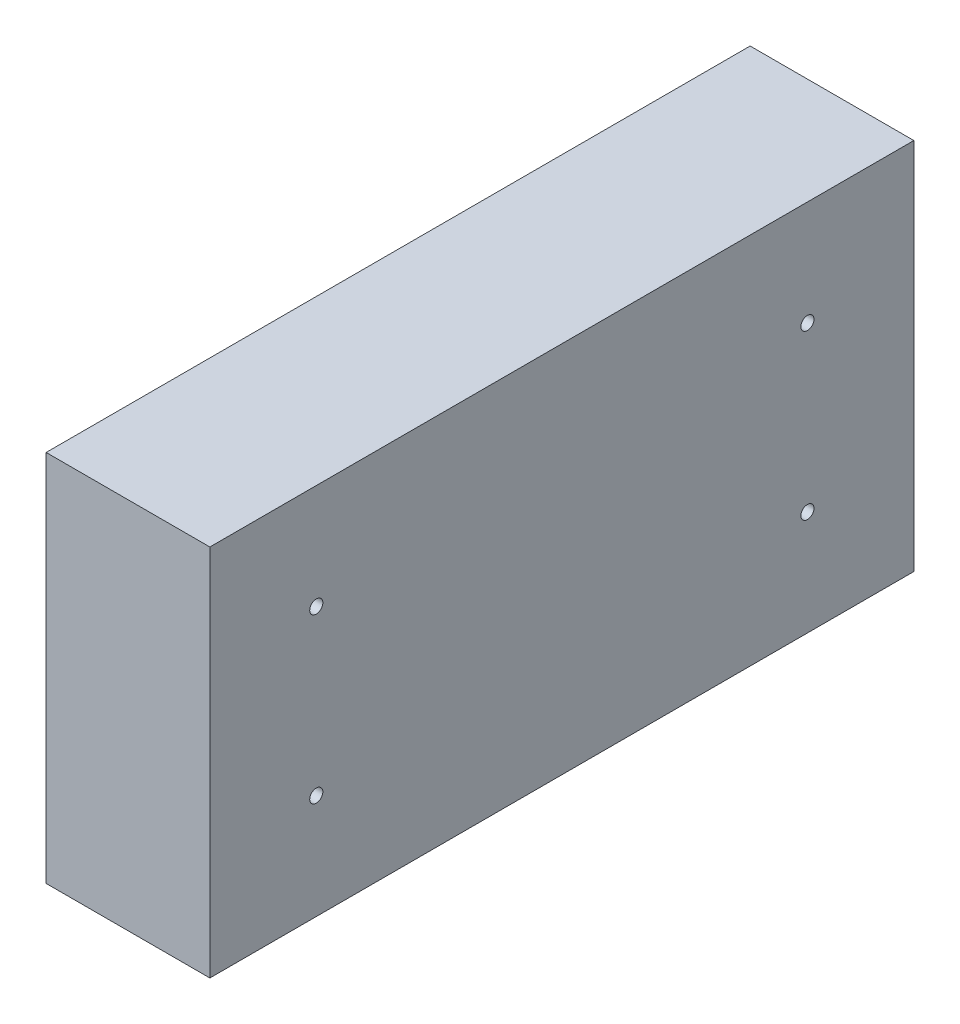
ISO-10303-21;
HEADER;
FILE_DESCRIPTION(('STEP AP214'),'2;1');
FILE_NAME('part.step','',(''),(''),'','','');
FILE_SCHEMA(('AUTOMOTIVE_DESIGN { 1 0 10303 214 1 1 1 1 }'));
ENDSEC;
DATA;
#1=APPLICATION_CONTEXT('core data for automotive mechanical design processes');
#2=APPLICATION_PROTOCOL_DEFINITION('international standard','automotive_design',2000,#1);
#3=PRODUCT_CONTEXT('',#1,'mechanical');
#4=PRODUCT('Part','Part','',(#3));
#5=PRODUCT_RELATED_PRODUCT_CATEGORY('part','',(#4));
#6=PRODUCT_DEFINITION_FORMATION('','',#4);
#7=PRODUCT_DEFINITION_CONTEXT('part definition',#1,'design');
#8=PRODUCT_DEFINITION('design','',#6,#7);
#9=PRODUCT_DEFINITION_SHAPE('','',#8);
#10=(LENGTH_UNIT() NAMED_UNIT(*) SI_UNIT(.MILLI.,.METRE.));
#11=(NAMED_UNIT(*) PLANE_ANGLE_UNIT() SI_UNIT($,.RADIAN.));
#12=(NAMED_UNIT(*) SI_UNIT($,.STERADIAN.) SOLID_ANGLE_UNIT());
#13=UNCERTAINTY_MEASURE_WITH_UNIT(LENGTH_MEASURE(1.E-05),#10,'distance_accuracy_value','');
#14=(GEOMETRIC_REPRESENTATION_CONTEXT(3) GLOBAL_UNCERTAINTY_ASSIGNED_CONTEXT((#13)) GLOBAL_UNIT_ASSIGNED_CONTEXT((#10,
#11,#12)) REPRESENTATION_CONTEXT('',''));
#15=CARTESIAN_POINT('',(0.,0.,0.));
#16=DIRECTION('',(0.,0.,1.));
#17=DIRECTION('',(1.,0.,0.));
#18=AXIS2_PLACEMENT_3D('',#15,#16,#17);
#19=CARTESIAN_POINT('',(50.,0.,0.));
#20=DIRECTION('',(0.,0.,1.));
#21=DIRECTION('',(1.,0.,0.));
#22=AXIS2_PLACEMENT_3D('',#19,#20,#21);
#23=PLANE('',#22);
#24=DIRECTION('',(0.,-1.,0.));
#25=VECTOR('',#24,1.);
#26=CARTESIAN_POINT('',(40.,108.700942107573,0.));
#27=LINE('',#26,#25);
#28=CARTESIAN_POINT('',(40.,108.700942107573,0.));
#29=VERTEX_POINT('',#28);
#30=CARTESIAN_POINT('',(40.,5.53247072361308,0.));
#31=VERTEX_POINT('',#30);
#32=EDGE_CURVE('E115',#29,#31,#27,.T.);
#33=ORIENTED_EDGE('',*,*,#32,.F.);
#34=DIRECTION('',(-1.,0.,0.));
#35=VECTOR('',#34,1.);
#36=CARTESIAN_POINT('',(40.,108.700942107573,0.));
#37=LINE('',#36,#35);
#38=CARTESIAN_POINT('',(0.,108.700942107573,0.));
#39=VERTEX_POINT('',#38);
#40=EDGE_CURVE('E175',#29,#39,#37,.T.);
#41=ORIENTED_EDGE('',*,*,#40,.T.);
#42=DIRECTION('',(0.,1.,0.));
#43=VECTOR('',#42,1.);
#44=CARTESIAN_POINT('',(0.,0.,0.));
#45=LINE('',#44,#43);
#46=CARTESIAN_POINT('',(0.,114.,0.));
#47=VERTEX_POINT('',#46);
#48=EDGE_CURVE('E144',#39,#47,#45,.T.);
#49=ORIENTED_EDGE('',*,*,#48,.T.);
#50=DIRECTION('',(-1.,0.,0.));
#51=VECTOR('',#50,1.);
#52=CARTESIAN_POINT('',(50.,114.,0.));
#53=LINE('',#52,#51);
#54=CARTESIAN_POINT('',(50.,114.,0.));
#55=VERTEX_POINT('',#54);
#56=EDGE_CURVE('E11',#55,#47,#53,.T.);
#57=ORIENTED_EDGE('',*,*,#56,.F.);
#58=DIRECTION('',(0.,1.,0.));
#59=VECTOR('',#58,1.);
#60=CARTESIAN_POINT('',(50.,0.,0.));
#61=LINE('',#60,#59);
#62=CARTESIAN_POINT('',(50.,0.,0.));
#63=VERTEX_POINT('',#62);
#64=EDGE_CURVE('E135',#63,#55,#61,.T.);
#65=ORIENTED_EDGE('',*,*,#64,.F.);
#66=DIRECTION('',(-1.,0.,0.));
#67=VECTOR('',#66,1.);
#68=CARTESIAN_POINT('',(50.,0.,0.));
#69=LINE('',#68,#67);
#70=CARTESIAN_POINT('',(0.,0.,0.));
#71=VERTEX_POINT('',#70);
#72=EDGE_CURVE('E141',#63,#71,#69,.T.);
#73=ORIENTED_EDGE('',*,*,#72,.T.);
#74=CARTESIAN_POINT('',(0.,5.53247072361308,0.));
#75=VERTEX_POINT('',#74);
#76=EDGE_CURVE('E128',#71,#75,#45,.T.);
#77=ORIENTED_EDGE('',*,*,#76,.T.);
#78=DIRECTION('',(-1.,0.,0.));
#79=VECTOR('',#78,1.);
#80=CARTESIAN_POINT('',(40.,5.53247072361308,0.));
#81=LINE('',#80,#79);
#82=EDGE_CURVE('E49',#31,#75,#81,.T.);
#83=ORIENTED_EDGE('',*,*,#82,.F.);
#84=EDGE_LOOP('',(#33,#41,#49,#57,#65,#73,#77,#83));
#85=FACE_BOUND('',#84,.T.);
#86=ADVANCED_FACE('F35',(#85),#23,.F.);
#87=CARTESIAN_POINT('',(50.,114.,0.));
#88=DIRECTION('',(0.,-1.,0.));
#89=DIRECTION('',(0.,0.,-1.));
#90=AXIS2_PLACEMENT_3D('',#87,#88,#89);
#91=PLANE('',#90);
#92=DIRECTION('',(0.,0.,1.));
#93=VECTOR('',#92,1.);
#94=CARTESIAN_POINT('',(0.,114.,0.));
#95=LINE('',#94,#93);
#96=CARTESIAN_POINT('',(0.,114.,215.));
#97=VERTEX_POINT('',#96);
#98=EDGE_CURVE('E143',#47,#97,#95,.T.);
#99=ORIENTED_EDGE('',*,*,#98,.T.);
#100=DIRECTION('',(-1.,0.,0.));
#101=VECTOR('',#100,1.);
#102=CARTESIAN_POINT('',(50.,114.,215.));
#103=LINE('',#102,#101);
#104=CARTESIAN_POINT('',(50.,114.,215.));
#105=VERTEX_POINT('',#104);
#106=EDGE_CURVE('E42',#105,#97,#103,.T.);
#107=ORIENTED_EDGE('',*,*,#106,.F.);
#108=DIRECTION('',(0.,0.,1.));
#109=VECTOR('',#108,1.);
#110=CARTESIAN_POINT('',(50.,114.,0.));
#111=LINE('',#110,#109);
#112=EDGE_CURVE('E86',#55,#105,#111,.T.);
#113=ORIENTED_EDGE('',*,*,#112,.F.);
#114=ORIENTED_EDGE('',*,*,#56,.T.);
#115=EDGE_LOOP('',(#99,#107,#113,#114));
#116=FACE_BOUND('',#115,.T.);
#117=ADVANCED_FACE('F182',(#116),#91,.F.);
#118=CARTESIAN_POINT('',(50.,0.,215.));
#119=DIRECTION('',(0.,0.,-1.));
#120=DIRECTION('',(-1.,0.,0.));
#121=AXIS2_PLACEMENT_3D('',#118,#119,#120);
#122=PLANE('',#121);
#123=DIRECTION('',(0.,-1.,0.));
#124=VECTOR('',#123,1.);
#125=CARTESIAN_POINT('',(0.,0.,215.));
#126=LINE('',#125,#124);
#127=CARTESIAN_POINT('',(0.,0.,215.));
#128=VERTEX_POINT('',#127);
#129=EDGE_CURVE('E146',#97,#128,#126,.T.);
#130=ORIENTED_EDGE('',*,*,#129,.T.);
#131=DIRECTION('',(-1.,0.,0.));
#132=VECTOR('',#131,1.);
#133=CARTESIAN_POINT('',(50.,0.,215.));
#134=LINE('',#133,#132);
#135=CARTESIAN_POINT('',(50.,0.,215.));
#136=VERTEX_POINT('',#135);
#137=EDGE_CURVE('E150',#136,#128,#134,.T.);
#138=ORIENTED_EDGE('',*,*,#137,.F.);
#139=DIRECTION('',(0.,-1.,0.));
#140=VECTOR('',#139,1.);
#141=CARTESIAN_POINT('',(50.,0.,215.));
#142=LINE('',#141,#140);
#143=EDGE_CURVE('E138',#105,#136,#142,.T.);
#144=ORIENTED_EDGE('',*,*,#143,.F.);
#145=ORIENTED_EDGE('',*,*,#106,.T.);
#146=EDGE_LOOP('',(#130,#138,#144,#145));
#147=FACE_BOUND('',#146,.T.);
#148=ADVANCED_FACE('F155',(#147),#122,.F.);
#149=CARTESIAN_POINT('',(50.,0.,0.));
#150=DIRECTION('',(0.,1.,0.));
#151=DIRECTION('',(0.,0.,1.));
#152=AXIS2_PLACEMENT_3D('',#149,#150,#151);
#153=PLANE('',#152);
#154=DIRECTION('',(0.,0.,-1.));
#155=VECTOR('',#154,1.);
#156=CARTESIAN_POINT('',(0.,0.,0.));
#157=LINE('',#156,#155);
#158=EDGE_CURVE('E79',#128,#71,#157,.T.);
#159=ORIENTED_EDGE('',*,*,#158,.T.);
#160=ORIENTED_EDGE('',*,*,#72,.F.);
#161=DIRECTION('',(0.,0.,-1.));
#162=VECTOR('',#161,1.);
#163=CARTESIAN_POINT('',(50.,0.,0.));
#164=LINE('',#163,#162);
#165=EDGE_CURVE('E58',#136,#63,#164,.T.);
#166=ORIENTED_EDGE('',*,*,#165,.F.);
#167=ORIENTED_EDGE('',*,*,#137,.T.);
#168=EDGE_LOOP('',(#159,#160,#166,#167));
#169=FACE_BOUND('',#168,.T.);
#170=ADVANCED_FACE('F188',(#169),#153,.F.);
#171=CARTESIAN_POINT('',(50.,0.,0.));
#172=DIRECTION('',(1.,0.,0.));
#173=DIRECTION('',(0.,0.,-1.));
#174=AXIS2_PLACEMENT_3D('',#171,#172,#173);
#175=PLANE('',#174);
#176=CARTESIAN_POINT('',(50.,82.,32.5));
#177=DIRECTION('',(1.,0.,0.));
#178=DIRECTION('',(0.,0.,-1.));
#179=AXIS2_PLACEMENT_3D('',#176,#177,#178);
#180=CIRCLE('',#179,2.);
#181=CARTESIAN_POINT('',(50.,82.,30.5));
#182=VERTEX_POINT('',#181);
#183=EDGE_CURVE('E243',#182,#182,#180,.T.);
#184=ORIENTED_EDGE('',*,*,#183,.F.);
#185=EDGE_LOOP('',(#184));
#186=FACE_BOUND('',#185,.T.);
#187=CARTESIAN_POINT('',(50.,32.,32.5));
#188=DIRECTION('',(1.,0.,0.));
#189=DIRECTION('',(0.,0.,-1.));
#190=AXIS2_PLACEMENT_3D('',#187,#188,#189);
#191=CIRCLE('',#190,2.);
#192=CARTESIAN_POINT('',(50.,32.,30.5));
#193=VERTEX_POINT('',#192);
#194=EDGE_CURVE('E253',#193,#193,#191,.T.);
#195=ORIENTED_EDGE('',*,*,#194,.F.);
#196=EDGE_LOOP('',(#195));
#197=FACE_BOUND('',#196,.T.);
#198=CARTESIAN_POINT('',(50.,32.,182.5));
#199=DIRECTION('',(1.,0.,0.));
#200=DIRECTION('',(0.,0.,-1.));
#201=AXIS2_PLACEMENT_3D('',#198,#199,#200);
#202=CIRCLE('',#201,2.00000000000002);
#203=CARTESIAN_POINT('',(50.,32.,180.5));
#204=VERTEX_POINT('',#203);
#205=EDGE_CURVE('E259',#204,#204,#202,.T.);
#206=ORIENTED_EDGE('',*,*,#205,.F.);
#207=EDGE_LOOP('',(#206));
#208=FACE_BOUND('',#207,.T.);
#209=CARTESIAN_POINT('',(50.,82.,182.5));
#210=DIRECTION('',(1.,0.,0.));
#211=DIRECTION('',(0.,0.,-1.));
#212=AXIS2_PLACEMENT_3D('',#209,#210,#211);
#213=CIRCLE('',#212,2.);
#214=CARTESIAN_POINT('',(50.,82.,180.5));
#215=VERTEX_POINT('',#214);
#216=EDGE_CURVE('E170',#215,#215,#213,.T.);
#217=ORIENTED_EDGE('',*,*,#216,.F.);
#218=EDGE_LOOP('',(#217));
#219=FACE_BOUND('',#218,.T.);
#220=ORIENTED_EDGE('',*,*,#64,.T.);
#221=ORIENTED_EDGE('',*,*,#112,.T.);
#222=ORIENTED_EDGE('',*,*,#143,.T.);
#223=ORIENTED_EDGE('',*,*,#165,.T.);
#224=EDGE_LOOP('',(#220,#221,#222,#223));
#225=FACE_BOUND('',#224,.T.);
#226=ADVANCED_FACE('F193',(#186,#197,#208,#219,#225),#175,.T.);
#227=CARTESIAN_POINT('',(0.,0.,0.));
#228=DIRECTION('',(1.,0.,0.));
#229=DIRECTION('',(0.,0.,-1.));
#230=AXIS2_PLACEMENT_3D('',#227,#228,#229);
#231=PLANE('',#230);
#232=ORIENTED_EDGE('',*,*,#48,.F.);
#233=DIRECTION('',(0.,0.,-1.));
#234=VECTOR('',#233,1.);
#235=CARTESIAN_POINT('',(0.,108.700942107573,0.));
#236=LINE('',#235,#234);
#237=CARTESIAN_POINT('',(0.,108.700942107573,22.3043166173184));
#238=VERTEX_POINT('',#237);
#239=EDGE_CURVE('E124',#238,#39,#236,.T.);
#240=ORIENTED_EDGE('',*,*,#239,.F.);
#241=DIRECTION('',(0.,1.,0.));
#242=VECTOR('',#241,1.);
#243=CARTESIAN_POINT('',(0.,108.700942107573,22.3043166173184));
#244=LINE('',#243,#242);
#245=CARTESIAN_POINT('',(0.,5.53247072361308,22.3043166173184));
#246=VERTEX_POINT('',#245);
#247=EDGE_CURVE('E165',#246,#238,#244,.T.);
#248=ORIENTED_EDGE('',*,*,#247,.F.);
#249=DIRECTION('',(0.,0.,1.));
#250=VECTOR('',#249,1.);
#251=CARTESIAN_POINT('',(0.,5.53247072361308,0.));
#252=LINE('',#251,#250);
#253=EDGE_CURVE('E162',#75,#246,#252,.T.);
#254=ORIENTED_EDGE('',*,*,#253,.F.);
#255=ORIENTED_EDGE('',*,*,#76,.F.);
#256=ORIENTED_EDGE('',*,*,#158,.F.);
#257=ORIENTED_EDGE('',*,*,#129,.F.);
#258=ORIENTED_EDGE('',*,*,#98,.F.);
#259=EDGE_LOOP('',(#232,#240,#248,#254,#255,#256,#257,#258));
#260=FACE_BOUND('',#259,.T.);
#261=ADVANCED_FACE('F160',(#260),#231,.F.);
#262=CARTESIAN_POINT('',(40.,108.700942107573,0.));
#263=DIRECTION('',(0.,1.,0.));
#264=DIRECTION('',(0.,0.,1.));
#265=AXIS2_PLACEMENT_3D('',#262,#263,#264);
#266=PLANE('',#265);
#267=ORIENTED_EDGE('',*,*,#239,.T.);
#268=ORIENTED_EDGE('',*,*,#40,.F.);
#269=DIRECTION('',(0.,0.,-1.));
#270=VECTOR('',#269,1.);
#271=CARTESIAN_POINT('',(40.,108.700942107573,0.));
#272=LINE('',#271,#270);
#273=CARTESIAN_POINT('',(40.,108.700942107573,22.3043166173184));
#274=VERTEX_POINT('',#273);
#275=EDGE_CURVE('E121',#274,#29,#272,.T.);
#276=ORIENTED_EDGE('',*,*,#275,.F.);
#277=DIRECTION('',(-1.,0.,0.));
#278=VECTOR('',#277,1.);
#279=CARTESIAN_POINT('',(40.,108.700942107573,22.3043166173184));
#280=LINE('',#279,#278);
#281=EDGE_CURVE('E130',#274,#238,#280,.T.);
#282=ORIENTED_EDGE('',*,*,#281,.T.);
#283=EDGE_LOOP('',(#267,#268,#276,#282));
#284=FACE_BOUND('',#283,.T.);
#285=ADVANCED_FACE('F177',(#284),#266,.F.);
#286=CARTESIAN_POINT('',(40.,108.700942107573,22.3043166173184));
#287=DIRECTION('',(0.,0.,1.));
#288=DIRECTION('',(1.,0.,0.));
#289=AXIS2_PLACEMENT_3D('',#286,#287,#288);
#290=PLANE('',#289);
#291=ORIENTED_EDGE('',*,*,#247,.T.);
#292=ORIENTED_EDGE('',*,*,#281,.F.);
#293=DIRECTION('',(0.,1.,0.));
#294=VECTOR('',#293,1.);
#295=CARTESIAN_POINT('',(40.,108.700942107573,22.3043166173184));
#296=LINE('',#295,#294);
#297=CARTESIAN_POINT('',(40.,5.53247072361308,22.3043166173184));
#298=VERTEX_POINT('',#297);
#299=EDGE_CURVE('E114',#298,#274,#296,.T.);
#300=ORIENTED_EDGE('',*,*,#299,.F.);
#301=DIRECTION('',(-1.,0.,0.));
#302=VECTOR('',#301,1.);
#303=CARTESIAN_POINT('',(40.,5.53247072361308,22.3043166173184));
#304=LINE('',#303,#302);
#305=EDGE_CURVE('E110',#298,#246,#304,.T.);
#306=ORIENTED_EDGE('',*,*,#305,.T.);
#307=EDGE_LOOP('',(#291,#292,#300,#306));
#308=FACE_BOUND('',#307,.T.);
#309=ADVANCED_FACE('F179',(#308),#290,.F.);
#310=CARTESIAN_POINT('',(40.,5.53247072361308,0.));
#311=DIRECTION('',(0.,-1.,0.));
#312=DIRECTION('',(0.,0.,-1.));
#313=AXIS2_PLACEMENT_3D('',#310,#311,#312);
#314=PLANE('',#313);
#315=ORIENTED_EDGE('',*,*,#253,.T.);
#316=ORIENTED_EDGE('',*,*,#305,.F.);
#317=DIRECTION('',(0.,0.,1.));
#318=VECTOR('',#317,1.);
#319=CARTESIAN_POINT('',(40.,5.53247072361308,0.));
#320=LINE('',#319,#318);
#321=EDGE_CURVE('E107',#31,#298,#320,.T.);
#322=ORIENTED_EDGE('',*,*,#321,.F.);
#323=ORIENTED_EDGE('',*,*,#82,.T.);
#324=EDGE_LOOP('',(#315,#316,#322,#323));
#325=FACE_BOUND('',#324,.T.);
#326=ADVANCED_FACE('F109',(#325),#314,.F.);
#327=CARTESIAN_POINT('',(40.,0.,0.));
#328=DIRECTION('',(-1.,0.,0.));
#329=DIRECTION('',(0.,0.,1.));
#330=AXIS2_PLACEMENT_3D('',#327,#328,#329);
#331=PLANE('',#330);
#332=ORIENTED_EDGE('',*,*,#32,.T.);
#333=ORIENTED_EDGE('',*,*,#321,.T.);
#334=ORIENTED_EDGE('',*,*,#299,.T.);
#335=ORIENTED_EDGE('',*,*,#275,.T.);
#336=EDGE_LOOP('',(#332,#333,#334,#335));
#337=FACE_BOUND('',#336,.T.);
#338=ADVANCED_FACE('F119',(#337),#331,.T.);
#339=CARTESIAN_POINT('',(46.,82.,182.5));
#340=DIRECTION('',(1.,0.,0.));
#341=DIRECTION('',(0.,0.,-1.));
#342=AXIS2_PLACEMENT_3D('',#339,#340,#341);
#343=CYLINDRICAL_SURFACE('',#342,2.);
#344=CARTESIAN_POINT('',(46.,82.,182.5));
#345=DIRECTION('',(1.,0.,0.));
#346=DIRECTION('',(0.,0.,-1.));
#347=AXIS2_PLACEMENT_3D('',#344,#345,#346);
#348=CIRCLE('',#347,2.);
#349=CARTESIAN_POINT('',(46.,82.,180.5));
#350=VERTEX_POINT('',#349);
#351=EDGE_CURVE('E166',#350,#350,#348,.T.);
#352=ORIENTED_EDGE('',*,*,#351,.F.);
#353=EDGE_LOOP('',(#352));
#354=FACE_BOUND('',#353,.T.);
#355=ORIENTED_EDGE('',*,*,#216,.T.);
#356=EDGE_LOOP('',(#355));
#357=FACE_BOUND('',#356,.T.);
#358=ADVANCED_FACE('F207',(#354,#357),#343,.F.);
#359=CARTESIAN_POINT('',(46.,82.,182.5));
#360=DIRECTION('',(1.,0.,0.));
#361=DIRECTION('',(0.,0.,-1.));
#362=AXIS2_PLACEMENT_3D('',#359,#360,#361);
#363=PLANE('',#362);
#364=ORIENTED_EDGE('',*,*,#351,.T.);
#365=EDGE_LOOP('',(#364));
#366=FACE_BOUND('',#365,.T.);
#367=ADVANCED_FACE('F210',(#366),#363,.T.);
#368=CARTESIAN_POINT('',(46.,32.,182.5));
#369=DIRECTION('',(1.,0.,0.));
#370=DIRECTION('',(0.,0.,-1.));
#371=AXIS2_PLACEMENT_3D('',#368,#369,#370);
#372=CYLINDRICAL_SURFACE('',#371,2.00000000000002);
#373=CARTESIAN_POINT('',(46.,32.,182.5));
#374=DIRECTION('',(1.,0.,0.));
#375=DIRECTION('',(0.,0.,-1.));
#376=AXIS2_PLACEMENT_3D('',#373,#374,#375);
#377=CIRCLE('',#376,2.00000000000002);
#378=CARTESIAN_POINT('',(46.,32.,180.5));
#379=VERTEX_POINT('',#378);
#380=EDGE_CURVE('E256',#379,#379,#377,.T.);
#381=ORIENTED_EDGE('',*,*,#380,.F.);
#382=EDGE_LOOP('',(#381));
#383=FACE_BOUND('',#382,.T.);
#384=ORIENTED_EDGE('',*,*,#205,.T.);
#385=EDGE_LOOP('',(#384));
#386=FACE_BOUND('',#385,.T.);
#387=ADVANCED_FACE('F214',(#383,#386),#372,.F.);
#388=CARTESIAN_POINT('',(46.,32.,182.5));
#389=DIRECTION('',(1.,0.,0.));
#390=DIRECTION('',(0.,0.,-1.));
#391=AXIS2_PLACEMENT_3D('',#388,#389,#390);
#392=PLANE('',#391);
#393=ORIENTED_EDGE('',*,*,#380,.T.);
#394=EDGE_LOOP('',(#393));
#395=FACE_BOUND('',#394,.T.);
#396=ADVANCED_FACE('F218',(#395),#392,.T.);
#397=CARTESIAN_POINT('',(46.,32.,32.5));
#398=DIRECTION('',(1.,0.,0.));
#399=DIRECTION('',(0.,0.,-1.));
#400=AXIS2_PLACEMENT_3D('',#397,#398,#399);
#401=CYLINDRICAL_SURFACE('',#400,2.);
#402=CARTESIAN_POINT('',(46.,32.,32.5));
#403=DIRECTION('',(1.,0.,0.));
#404=DIRECTION('',(0.,0.,-1.));
#405=AXIS2_PLACEMENT_3D('',#402,#403,#404);
#406=CIRCLE('',#405,2.);
#407=CARTESIAN_POINT('',(46.,32.,30.5));
#408=VERTEX_POINT('',#407);
#409=EDGE_CURVE('E248',#408,#408,#406,.T.);
#410=ORIENTED_EDGE('',*,*,#409,.F.);
#411=EDGE_LOOP('',(#410));
#412=FACE_BOUND('',#411,.T.);
#413=ORIENTED_EDGE('',*,*,#194,.T.);
#414=EDGE_LOOP('',(#413));
#415=FACE_BOUND('',#414,.T.);
#416=ADVANCED_FACE('F222',(#412,#415),#401,.F.);
#417=CARTESIAN_POINT('',(46.,32.,32.5));
#418=DIRECTION('',(1.,0.,0.));
#419=DIRECTION('',(0.,0.,-1.));
#420=AXIS2_PLACEMENT_3D('',#417,#418,#419);
#421=PLANE('',#420);
#422=ORIENTED_EDGE('',*,*,#409,.T.);
#423=EDGE_LOOP('',(#422));
#424=FACE_BOUND('',#423,.T.);
#425=ADVANCED_FACE('F226',(#424),#421,.T.);
#426=CARTESIAN_POINT('',(46.,82.,32.5));
#427=DIRECTION('',(1.,0.,0.));
#428=DIRECTION('',(0.,0.,-1.));
#429=AXIS2_PLACEMENT_3D('',#426,#427,#428);
#430=CYLINDRICAL_SURFACE('',#429,2.);
#431=CARTESIAN_POINT('',(46.,82.,32.5));
#432=DIRECTION('',(1.,0.,0.));
#433=DIRECTION('',(0.,0.,-1.));
#434=AXIS2_PLACEMENT_3D('',#431,#432,#433);
#435=CIRCLE('',#434,2.);
#436=CARTESIAN_POINT('',(46.,82.,30.5));
#437=VERTEX_POINT('',#436);
#438=EDGE_CURVE('E242',#437,#437,#435,.T.);
#439=ORIENTED_EDGE('',*,*,#438,.F.);
#440=EDGE_LOOP('',(#439));
#441=FACE_BOUND('',#440,.T.);
#442=ORIENTED_EDGE('',*,*,#183,.T.);
#443=EDGE_LOOP('',(#442));
#444=FACE_BOUND('',#443,.T.);
#445=ADVANCED_FACE('F230',(#441,#444),#430,.F.);
#446=CARTESIAN_POINT('',(46.,82.,32.5));
#447=DIRECTION('',(1.,0.,0.));
#448=DIRECTION('',(0.,0.,-1.));
#449=AXIS2_PLACEMENT_3D('',#446,#447,#448);
#450=PLANE('',#449);
#451=ORIENTED_EDGE('',*,*,#438,.T.);
#452=EDGE_LOOP('',(#451));
#453=FACE_BOUND('',#452,.T.);
#454=ADVANCED_FACE('F234',(#453),#450,.T.);
#455=CLOSED_SHELL('',(#86,#117,#148,#170,#226,#261,#285,#309,#326,#338,#358,#367,#387,#396,#416,
#425,#445,#454));
#456=MANIFOLD_SOLID_BREP('B2',#455);
#457=ADVANCED_BREP_SHAPE_REPRESENTATION('',(#18,#456),#14);
#458=SHAPE_DEFINITION_REPRESENTATION(#9,#457);
ENDSEC;
END-ISO-10303-21;
